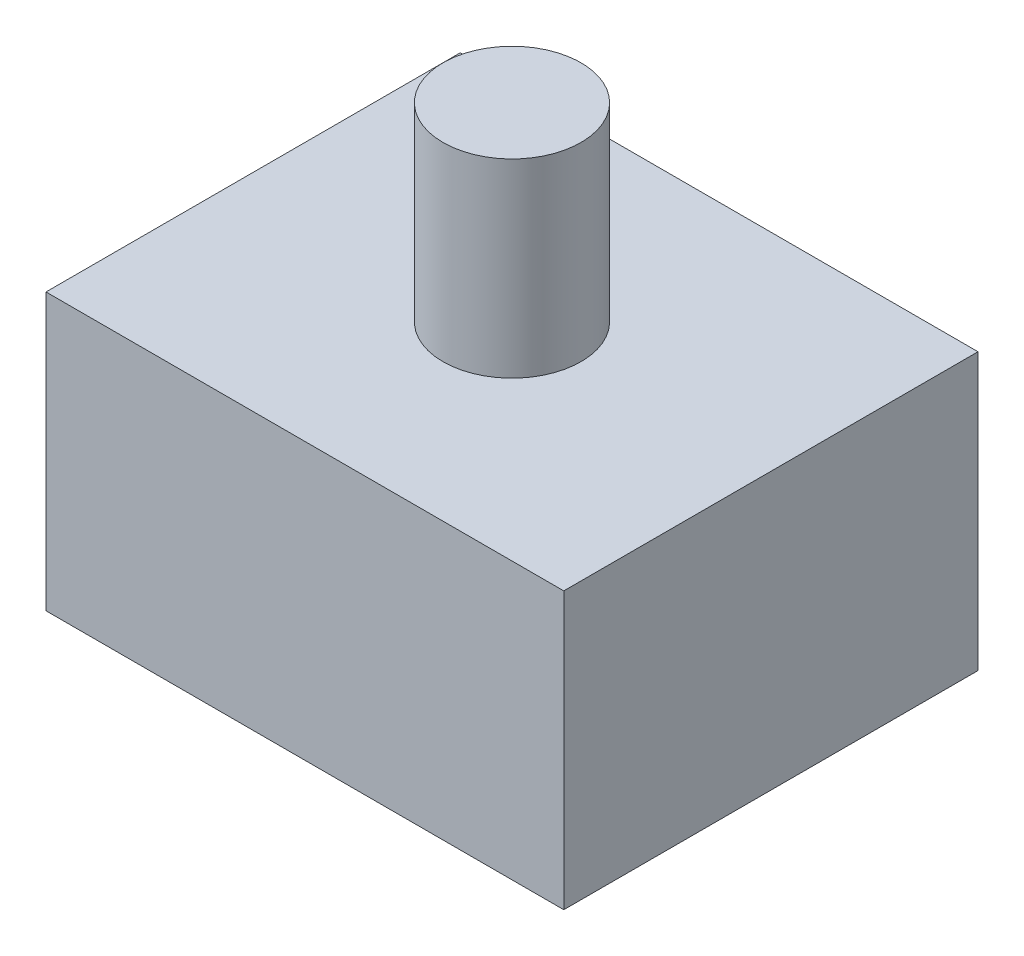
ISO-10303-21;
HEADER;
FILE_DESCRIPTION(('STEP AP214'),'2;1');
FILE_NAME('part.step','',(''),(''),'','','');
FILE_SCHEMA(('AUTOMOTIVE_DESIGN { 1 0 10303 214 1 1 1 1 }'));
ENDSEC;
DATA;
#1=APPLICATION_CONTEXT('core data for automotive mechanical design processes');
#2=APPLICATION_PROTOCOL_DEFINITION('international standard','automotive_design',2000,#1);
#3=PRODUCT_CONTEXT('',#1,'mechanical');
#4=PRODUCT('Part','Part','',(#3));
#5=PRODUCT_RELATED_PRODUCT_CATEGORY('part','',(#4));
#6=PRODUCT_DEFINITION_FORMATION('','',#4);
#7=PRODUCT_DEFINITION_CONTEXT('part definition',#1,'design');
#8=PRODUCT_DEFINITION('design','',#6,#7);
#9=PRODUCT_DEFINITION_SHAPE('','',#8);
#10=(LENGTH_UNIT() NAMED_UNIT(*) SI_UNIT(.MILLI.,.METRE.));
#11=(NAMED_UNIT(*) PLANE_ANGLE_UNIT() SI_UNIT($,.RADIAN.));
#12=(NAMED_UNIT(*) SI_UNIT($,.STERADIAN.) SOLID_ANGLE_UNIT());
#13=UNCERTAINTY_MEASURE_WITH_UNIT(LENGTH_MEASURE(1.E-05),#10,'distance_accuracy_value','');
#14=(GEOMETRIC_REPRESENTATION_CONTEXT(3) GLOBAL_UNCERTAINTY_ASSIGNED_CONTEXT((#13)) GLOBAL_UNIT_ASSIGNED_CONTEXT((#10,
#11,#12)) REPRESENTATION_CONTEXT('',''));
#15=CARTESIAN_POINT('',(0.,0.,0.));
#16=DIRECTION('',(0.,0.,1.));
#17=DIRECTION('',(1.,0.,0.));
#18=AXIS2_PLACEMENT_3D('',#15,#16,#17);
#19=CARTESIAN_POINT('',(15.,16.,-12.));
#20=DIRECTION('',(-1.,0.,0.));
#21=DIRECTION('',(0.,0.,1.));
#22=AXIS2_PLACEMENT_3D('',#19,#20,#21);
#23=PLANE('',#22);
#24=DIRECTION('',(0.,0.,-1.));
#25=VECTOR('',#24,1.);
#26=CARTESIAN_POINT('',(15.,0.,-12.));
#27=LINE('',#26,#25);
#28=CARTESIAN_POINT('',(15.,0.,12.));
#29=VERTEX_POINT('',#28);
#30=CARTESIAN_POINT('',(15.,0.,-12.));
#31=VERTEX_POINT('',#30);
#32=EDGE_CURVE('E99',#29,#31,#27,.T.);
#33=ORIENTED_EDGE('',*,*,#32,.T.);
#34=DIRECTION('',(0.,-1.,0.));
#35=VECTOR('',#34,1.);
#36=CARTESIAN_POINT('',(15.,16.,-12.));
#37=LINE('',#36,#35);
#38=CARTESIAN_POINT('',(15.,16.,-12.));
#39=VERTEX_POINT('',#38);
#40=EDGE_CURVE('E36',#39,#31,#37,.T.);
#41=ORIENTED_EDGE('',*,*,#40,.F.);
#42=DIRECTION('',(0.,0.,-1.));
#43=VECTOR('',#42,1.);
#44=CARTESIAN_POINT('',(15.,16.,-12.));
#45=LINE('',#44,#43);
#46=CARTESIAN_POINT('',(15.,16.,12.));
#47=VERTEX_POINT('',#46);
#48=EDGE_CURVE('E86',#47,#39,#45,.T.);
#49=ORIENTED_EDGE('',*,*,#48,.F.);
#50=DIRECTION('',(0.,-1.,0.));
#51=VECTOR('',#50,1.);
#52=CARTESIAN_POINT('',(15.,16.,12.));
#53=LINE('',#52,#51);
#54=EDGE_CURVE('E95',#47,#29,#53,.T.);
#55=ORIENTED_EDGE('',*,*,#54,.T.);
#56=EDGE_LOOP('',(#33,#41,#49,#55));
#57=FACE_BOUND('',#56,.T.);
#58=ADVANCED_FACE('F33',(#57),#23,.F.);
#59=CARTESIAN_POINT('',(-15.,16.,-12.));
#60=DIRECTION('',(0.,0.,1.));
#61=DIRECTION('',(1.,0.,0.));
#62=AXIS2_PLACEMENT_3D('',#59,#60,#61);
#63=PLANE('',#62);
#64=DIRECTION('',(-1.,0.,0.));
#65=VECTOR('',#64,1.);
#66=CARTESIAN_POINT('',(-15.,0.,-12.));
#67=LINE('',#66,#65);
#68=CARTESIAN_POINT('',(-15.,0.,-12.));
#69=VERTEX_POINT('',#68);
#70=EDGE_CURVE('E91',#31,#69,#67,.T.);
#71=ORIENTED_EDGE('',*,*,#70,.T.);
#72=DIRECTION('',(0.,-1.,0.));
#73=VECTOR('',#72,1.);
#74=CARTESIAN_POINT('',(-15.,16.,-12.));
#75=LINE('',#74,#73);
#76=CARTESIAN_POINT('',(-15.,16.,-12.));
#77=VERTEX_POINT('',#76);
#78=EDGE_CURVE('E89',#77,#69,#75,.T.);
#79=ORIENTED_EDGE('',*,*,#78,.F.);
#80=DIRECTION('',(-1.,0.,0.));
#81=VECTOR('',#80,1.);
#82=CARTESIAN_POINT('',(-15.,16.,-12.));
#83=LINE('',#82,#81);
#84=EDGE_CURVE('E81',#39,#77,#83,.T.);
#85=ORIENTED_EDGE('',*,*,#84,.F.);
#86=ORIENTED_EDGE('',*,*,#40,.T.);
#87=EDGE_LOOP('',(#71,#79,#85,#86));
#88=FACE_BOUND('',#87,.T.);
#89=ADVANCED_FACE('F90',(#88),#63,.F.);
#90=CARTESIAN_POINT('',(-15.,16.,-12.));
#91=DIRECTION('',(1.,0.,0.));
#92=DIRECTION('',(0.,0.,-1.));
#93=AXIS2_PLACEMENT_3D('',#90,#91,#92);
#94=PLANE('',#93);
#95=DIRECTION('',(0.,0.,1.));
#96=VECTOR('',#95,1.);
#97=CARTESIAN_POINT('',(-15.,0.,-12.));
#98=LINE('',#97,#96);
#99=CARTESIAN_POINT('',(-15.,0.,12.));
#100=VERTEX_POINT('',#99);
#101=EDGE_CURVE('E67',#69,#100,#98,.T.);
#102=ORIENTED_EDGE('',*,*,#101,.T.);
#103=DIRECTION('',(0.,-1.,0.));
#104=VECTOR('',#103,1.);
#105=CARTESIAN_POINT('',(-15.,16.,12.));
#106=LINE('',#105,#104);
#107=CARTESIAN_POINT('',(-15.,16.,12.));
#108=VERTEX_POINT('',#107);
#109=EDGE_CURVE('E92',#108,#100,#106,.T.);
#110=ORIENTED_EDGE('',*,*,#109,.F.);
#111=DIRECTION('',(0.,0.,1.));
#112=VECTOR('',#111,1.);
#113=CARTESIAN_POINT('',(-15.,16.,-12.));
#114=LINE('',#113,#112);
#115=EDGE_CURVE('E84',#77,#108,#114,.T.);
#116=ORIENTED_EDGE('',*,*,#115,.F.);
#117=ORIENTED_EDGE('',*,*,#78,.T.);
#118=EDGE_LOOP('',(#102,#110,#116,#117));
#119=FACE_BOUND('',#118,.T.);
#120=ADVANCED_FACE('F93',(#119),#94,.F.);
#121=CARTESIAN_POINT('',(-15.,16.,12.));
#122=DIRECTION('',(0.,0.,-1.));
#123=DIRECTION('',(-1.,0.,0.));
#124=AXIS2_PLACEMENT_3D('',#121,#122,#123);
#125=PLANE('',#124);
#126=DIRECTION('',(1.,0.,0.));
#127=VECTOR('',#126,1.);
#128=CARTESIAN_POINT('',(-15.,0.,12.));
#129=LINE('',#128,#127);
#130=EDGE_CURVE('E73',#100,#29,#129,.T.);
#131=ORIENTED_EDGE('',*,*,#130,.T.);
#132=ORIENTED_EDGE('',*,*,#54,.F.);
#133=DIRECTION('',(1.,0.,0.));
#134=VECTOR('',#133,1.);
#135=CARTESIAN_POINT('',(-15.,16.,12.));
#136=LINE('',#135,#134);
#137=EDGE_CURVE('E50',#108,#47,#136,.T.);
#138=ORIENTED_EDGE('',*,*,#137,.F.);
#139=ORIENTED_EDGE('',*,*,#109,.T.);
#140=EDGE_LOOP('',(#131,#132,#138,#139));
#141=FACE_BOUND('',#140,.T.);
#142=ADVANCED_FACE('F107',(#141),#125,.F.);
#143=CARTESIAN_POINT('',(0.,16.,0.));
#144=DIRECTION('',(0.,1.,0.));
#145=DIRECTION('',(0.,0.,1.));
#146=AXIS2_PLACEMENT_3D('',#143,#144,#145);
#147=PLANE('',#146);
#148=CARTESIAN_POINT('',(0.,16.,0.));
#149=DIRECTION('',(0.,1.,0.));
#150=DIRECTION('',(0.,0.,1.));
#151=AXIS2_PLACEMENT_3D('',#148,#149,#150);
#152=CIRCLE('',#151,4.);
#153=CARTESIAN_POINT('',(0.,16.,4.));
#154=VERTEX_POINT('',#153);
#155=EDGE_CURVE('E11',#154,#154,#152,.T.);
#156=ORIENTED_EDGE('',*,*,#155,.F.);
#157=EDGE_LOOP('',(#156));
#158=FACE_BOUND('',#157,.T.);
#159=ORIENTED_EDGE('',*,*,#48,.T.);
#160=ORIENTED_EDGE('',*,*,#84,.T.);
#161=ORIENTED_EDGE('',*,*,#115,.T.);
#162=ORIENTED_EDGE('',*,*,#137,.T.);
#163=EDGE_LOOP('',(#159,#160,#161,#162));
#164=FACE_BOUND('',#163,.T.);
#165=ADVANCED_FACE('F82',(#158,#164),#147,.T.);
#166=CARTESIAN_POINT('',(0.,0.,0.));
#167=DIRECTION('',(0.,1.,0.));
#168=DIRECTION('',(0.,0.,1.));
#169=AXIS2_PLACEMENT_3D('',#166,#167,#168);
#170=PLANE('',#169);
#171=ORIENTED_EDGE('',*,*,#32,.F.);
#172=ORIENTED_EDGE('',*,*,#130,.F.);
#173=ORIENTED_EDGE('',*,*,#101,.F.);
#174=ORIENTED_EDGE('',*,*,#70,.F.);
#175=EDGE_LOOP('',(#171,#172,#173,#174));
#176=FACE_BOUND('',#175,.T.);
#177=ADVANCED_FACE('F110',(#176),#170,.F.);
#178=CARTESIAN_POINT('',(0.,27.,0.));
#179=DIRECTION('',(0.,-1.,0.));
#180=DIRECTION('',(0.,0.,-1.));
#181=AXIS2_PLACEMENT_3D('',#178,#179,#180);
#182=CYLINDRICAL_SURFACE('',#181,4.);
#183=CARTESIAN_POINT('',(0.,27.,0.));
#184=DIRECTION('',(0.,1.,0.));
#185=DIRECTION('',(0.,0.,1.));
#186=AXIS2_PLACEMENT_3D('',#183,#184,#185);
#187=CIRCLE('',#186,4.);
#188=CARTESIAN_POINT('',(0.,27.,4.));
#189=VERTEX_POINT('',#188);
#190=EDGE_CURVE('E102',#189,#189,#187,.T.);
#191=ORIENTED_EDGE('',*,*,#190,.F.);
#192=EDGE_LOOP('',(#191));
#193=FACE_BOUND('',#192,.T.);
#194=ORIENTED_EDGE('',*,*,#155,.T.);
#195=EDGE_LOOP('',(#194));
#196=FACE_BOUND('',#195,.T.);
#197=ADVANCED_FACE('F118',(#193,#196),#182,.T.);
#198=CARTESIAN_POINT('',(0.,27.,0.));
#199=DIRECTION('',(0.,1.,0.));
#200=DIRECTION('',(0.,0.,1.));
#201=AXIS2_PLACEMENT_3D('',#198,#199,#200);
#202=PLANE('',#201);
#203=ORIENTED_EDGE('',*,*,#190,.T.);
#204=EDGE_LOOP('',(#203));
#205=FACE_BOUND('',#204,.T.);
#206=ADVANCED_FACE('F116',(#205),#202,.T.);
#207=CLOSED_SHELL('',(#58,#89,#120,#142,#165,#177,#197,#206));
#208=MANIFOLD_SOLID_BREP('B2',#207);
#209=ADVANCED_BREP_SHAPE_REPRESENTATION('',(#18,#208),#14);
#210=SHAPE_DEFINITION_REPRESENTATION(#9,#209);
ENDSEC;
END-ISO-10303-21;
